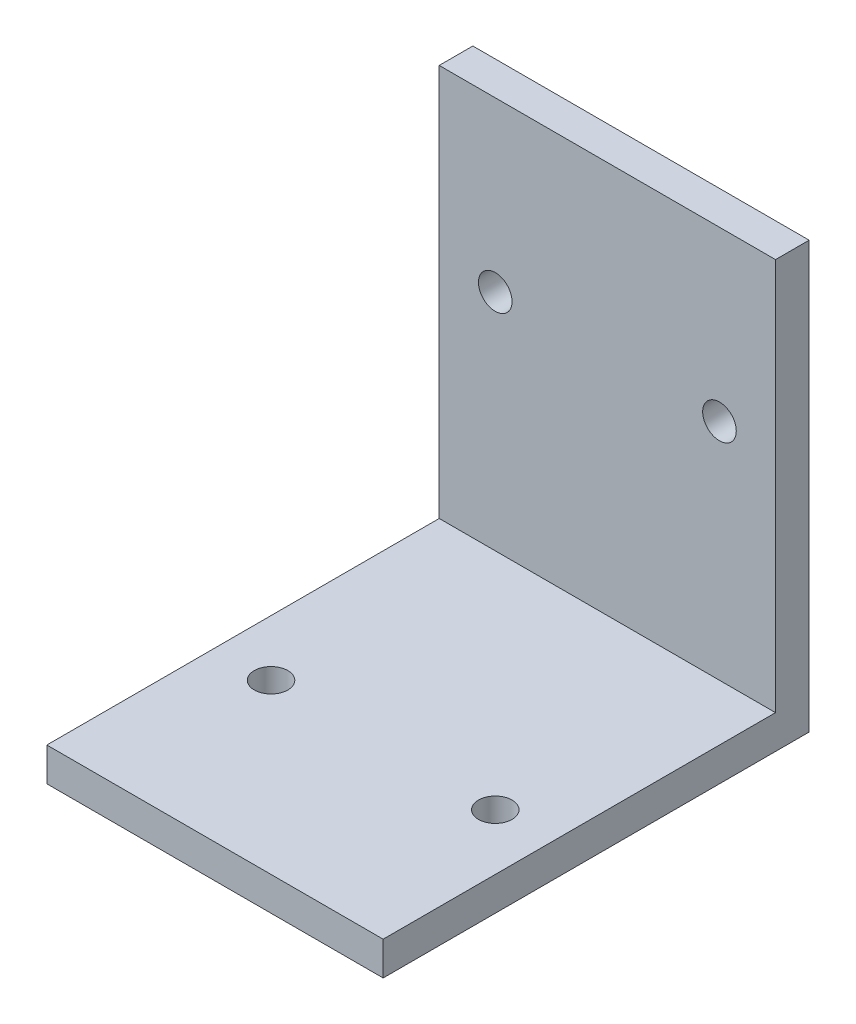
ISO-10303-21;
HEADER;
FILE_DESCRIPTION(('STEP AP214'),'2;1');
FILE_NAME('part.step','',(''),(''),'','','');
FILE_SCHEMA(('AUTOMOTIVE_DESIGN { 1 0 10303 214 1 1 1 1 }'));
ENDSEC;
DATA;
#1=APPLICATION_CONTEXT('core data for automotive mechanical design processes');
#2=APPLICATION_PROTOCOL_DEFINITION('international standard','automotive_design',2000,#1);
#3=PRODUCT_CONTEXT('',#1,'mechanical');
#4=PRODUCT('Part','Part','',(#3));
#5=PRODUCT_RELATED_PRODUCT_CATEGORY('part','',(#4));
#6=PRODUCT_DEFINITION_FORMATION('','',#4);
#7=PRODUCT_DEFINITION_CONTEXT('part definition',#1,'design');
#8=PRODUCT_DEFINITION('design','',#6,#7);
#9=PRODUCT_DEFINITION_SHAPE('','',#8);
#10=(LENGTH_UNIT() NAMED_UNIT(*) SI_UNIT(.MILLI.,.METRE.));
#11=(NAMED_UNIT(*) PLANE_ANGLE_UNIT() SI_UNIT($,.RADIAN.));
#12=(NAMED_UNIT(*) SI_UNIT($,.STERADIAN.) SOLID_ANGLE_UNIT());
#13=UNCERTAINTY_MEASURE_WITH_UNIT(LENGTH_MEASURE(1.E-05),#10,'distance_accuracy_value','');
#14=(GEOMETRIC_REPRESENTATION_CONTEXT(3) GLOBAL_UNCERTAINTY_ASSIGNED_CONTEXT((#13)) GLOBAL_UNIT_ASSIGNED_CONTEXT((#10,
#11,#12)) REPRESENTATION_CONTEXT('',''));
#15=CARTESIAN_POINT('',(0.,0.,0.));
#16=DIRECTION('',(0.,0.,1.));
#17=DIRECTION('',(1.,0.,0.));
#18=AXIS2_PLACEMENT_3D('',#15,#16,#17);
#19=CARTESIAN_POINT('',(15.,19.,3.));
#20=DIRECTION('',(-1.,0.,0.));
#21=DIRECTION('',(0.,0.,1.));
#22=AXIS2_PLACEMENT_3D('',#19,#20,#21);
#23=PLANE('',#22);
#24=DIRECTION('',(0.,1.,0.));
#25=VECTOR('',#24,1.);
#26=CARTESIAN_POINT('',(15.,19.,0.));
#27=LINE('',#26,#25);
#28=CARTESIAN_POINT('',(15.,-19.,0.));
#29=VERTEX_POINT('',#28);
#30=CARTESIAN_POINT('',(15.,19.,0.));
#31=VERTEX_POINT('',#30);
#32=EDGE_CURVE('E96',#29,#31,#27,.T.);
#33=ORIENTED_EDGE('',*,*,#32,.T.);
#34=DIRECTION('',(0.,0.,-1.));
#35=VECTOR('',#34,1.);
#36=CARTESIAN_POINT('',(15.,19.,3.));
#37=LINE('',#36,#35);
#38=CARTESIAN_POINT('',(15.,19.,3.));
#39=VERTEX_POINT('',#38);
#40=EDGE_CURVE('E11',#39,#31,#37,.T.);
#41=ORIENTED_EDGE('',*,*,#40,.F.);
#42=DIRECTION('',(0.,1.,0.));
#43=VECTOR('',#42,1.);
#44=CARTESIAN_POINT('',(15.,19.,3.));
#45=LINE('',#44,#43);
#46=CARTESIAN_POINT('',(15.,-16.,3.));
#47=VERTEX_POINT('',#46);
#48=EDGE_CURVE('E89',#47,#39,#45,.T.);
#49=ORIENTED_EDGE('',*,*,#48,.F.);
#50=DIRECTION('',(0.,0.,-1.));
#51=VECTOR('',#50,1.);
#52=CARTESIAN_POINT('',(15.,-16.,38.));
#53=LINE('',#52,#51);
#54=CARTESIAN_POINT('',(15.,-16.,38.));
#55=VERTEX_POINT('',#54);
#56=EDGE_CURVE('E104',#55,#47,#53,.T.);
#57=ORIENTED_EDGE('',*,*,#56,.F.);
#58=DIRECTION('',(0.,1.,0.));
#59=VECTOR('',#58,1.);
#60=CARTESIAN_POINT('',(15.,-19.,38.));
#61=LINE('',#60,#59);
#62=CARTESIAN_POINT('',(15.,-19.,38.));
#63=VERTEX_POINT('',#62);
#64=EDGE_CURVE('E99',#63,#55,#61,.T.);
#65=ORIENTED_EDGE('',*,*,#64,.F.);
#66=DIRECTION('',(0.,0.,-1.));
#67=VECTOR('',#66,1.);
#68=CARTESIAN_POINT('',(15.,-19.,3.));
#69=LINE('',#68,#67);
#70=EDGE_CURVE('E82',#63,#29,#69,.T.);
#71=ORIENTED_EDGE('',*,*,#70,.T.);
#72=EDGE_LOOP('',(#33,#41,#49,#57,#65,#71));
#73=FACE_BOUND('',#72,.T.);
#74=ADVANCED_FACE('F35',(#73),#23,.F.);
#75=CARTESIAN_POINT('',(-15.,19.,3.));
#76=DIRECTION('',(0.,-1.,0.));
#77=DIRECTION('',(0.,0.,-1.));
#78=AXIS2_PLACEMENT_3D('',#75,#76,#77);
#79=PLANE('',#78);
#80=DIRECTION('',(-1.,0.,0.));
#81=VECTOR('',#80,1.);
#82=CARTESIAN_POINT('',(-15.,19.,0.));
#83=LINE('',#82,#81);
#84=CARTESIAN_POINT('',(-15.,19.,0.));
#85=VERTEX_POINT('',#84);
#86=EDGE_CURVE('E103',#31,#85,#83,.T.);
#87=ORIENTED_EDGE('',*,*,#86,.T.);
#88=DIRECTION('',(0.,0.,-1.));
#89=VECTOR('',#88,1.);
#90=CARTESIAN_POINT('',(-15.,19.,3.));
#91=LINE('',#90,#89);
#92=CARTESIAN_POINT('',(-15.,19.,3.));
#93=VERTEX_POINT('',#92);
#94=EDGE_CURVE('E43',#93,#85,#91,.T.);
#95=ORIENTED_EDGE('',*,*,#94,.F.);
#96=DIRECTION('',(-1.,0.,0.));
#97=VECTOR('',#96,1.);
#98=CARTESIAN_POINT('',(-15.,19.,3.));
#99=LINE('',#98,#97);
#100=EDGE_CURVE('E57',#39,#93,#99,.T.);
#101=ORIENTED_EDGE('',*,*,#100,.F.);
#102=ORIENTED_EDGE('',*,*,#40,.T.);
#103=EDGE_LOOP('',(#87,#95,#101,#102));
#104=FACE_BOUND('',#103,.T.);
#105=ADVANCED_FACE('F161',(#104),#79,.F.);
#106=CARTESIAN_POINT('',(-15.,19.,3.));
#107=DIRECTION('',(1.,0.,0.));
#108=DIRECTION('',(0.,0.,-1.));
#109=AXIS2_PLACEMENT_3D('',#106,#107,#108);
#110=PLANE('',#109);
#111=DIRECTION('',(0.,-1.,0.));
#112=VECTOR('',#111,1.);
#113=CARTESIAN_POINT('',(-15.,19.,0.));
#114=LINE('',#113,#112);
#115=CARTESIAN_POINT('',(-15.,-19.,0.));
#116=VERTEX_POINT('',#115);
#117=EDGE_CURVE('E90',#85,#116,#114,.T.);
#118=ORIENTED_EDGE('',*,*,#117,.T.);
#119=DIRECTION('',(0.,0.,-1.));
#120=VECTOR('',#119,1.);
#121=CARTESIAN_POINT('',(-15.,-19.,3.));
#122=LINE('',#121,#120);
#123=CARTESIAN_POINT('',(-15.,-19.,38.));
#124=VERTEX_POINT('',#123);
#125=EDGE_CURVE('E85',#124,#116,#122,.T.);
#126=ORIENTED_EDGE('',*,*,#125,.F.);
#127=DIRECTION('',(0.,-1.,0.));
#128=VECTOR('',#127,1.);
#129=CARTESIAN_POINT('',(-15.,-19.,38.));
#130=LINE('',#129,#128);
#131=CARTESIAN_POINT('',(-15.,-16.,38.));
#132=VERTEX_POINT('',#131);
#133=EDGE_CURVE('E121',#132,#124,#130,.T.);
#134=ORIENTED_EDGE('',*,*,#133,.F.);
#135=DIRECTION('',(0.,0.,-1.));
#136=VECTOR('',#135,1.);
#137=CARTESIAN_POINT('',(-15.,-16.,38.));
#138=LINE('',#137,#136);
#139=CARTESIAN_POINT('',(-15.,-16.,3.));
#140=VERTEX_POINT('',#139);
#141=EDGE_CURVE('E108',#132,#140,#138,.T.);
#142=ORIENTED_EDGE('',*,*,#141,.T.);
#143=DIRECTION('',(0.,-1.,0.));
#144=VECTOR('',#143,1.);
#145=CARTESIAN_POINT('',(-15.,19.,3.));
#146=LINE('',#145,#144);
#147=EDGE_CURVE('E100',#93,#140,#146,.T.);
#148=ORIENTED_EDGE('',*,*,#147,.F.);
#149=ORIENTED_EDGE('',*,*,#94,.T.);
#150=EDGE_LOOP('',(#118,#126,#134,#142,#148,#149));
#151=FACE_BOUND('',#150,.T.);
#152=ADVANCED_FACE('F152',(#151),#110,.F.);
#153=CARTESIAN_POINT('',(-15.,-19.,3.));
#154=DIRECTION('',(0.,1.,0.));
#155=DIRECTION('',(0.,0.,1.));
#156=AXIS2_PLACEMENT_3D('',#153,#154,#155);
#157=PLANE('',#156);
#158=CARTESIAN_POINT('',(9.99999999999999,-19.,23.));
#159=DIRECTION('',(0.,1.,0.));
#160=DIRECTION('',(0.,0.,1.));
#161=AXIS2_PLACEMENT_3D('',#158,#159,#160);
#162=CIRCLE('',#161,1.5);
#163=CARTESIAN_POINT('',(9.99999999999999,-19.,24.5));
#164=VERTEX_POINT('',#163);
#165=EDGE_CURVE('E205',#164,#164,#162,.T.);
#166=ORIENTED_EDGE('',*,*,#165,.T.);
#167=EDGE_LOOP('',(#166));
#168=FACE_BOUND('',#167,.T.);
#169=CARTESIAN_POINT('',(-10.,-19.,23.));
#170=DIRECTION('',(0.,1.,0.));
#171=DIRECTION('',(0.,0.,1.));
#172=AXIS2_PLACEMENT_3D('',#169,#170,#171);
#173=CIRCLE('',#172,1.5);
#174=CARTESIAN_POINT('',(-10.,-19.,24.5));
#175=VERTEX_POINT('',#174);
#176=EDGE_CURVE('E209',#175,#175,#173,.T.);
#177=ORIENTED_EDGE('',*,*,#176,.T.);
#178=EDGE_LOOP('',(#177));
#179=FACE_BOUND('',#178,.T.);
#180=DIRECTION('',(1.,0.,0.));
#181=VECTOR('',#180,1.);
#182=CARTESIAN_POINT('',(-15.,-19.,0.));
#183=LINE('',#182,#181);
#184=EDGE_CURVE('E77',#116,#29,#183,.T.);
#185=ORIENTED_EDGE('',*,*,#184,.T.);
#186=ORIENTED_EDGE('',*,*,#70,.F.);
#187=DIRECTION('',(1.,0.,0.));
#188=VECTOR('',#187,1.);
#189=CARTESIAN_POINT('',(-15.,-19.,38.));
#190=LINE('',#189,#188);
#191=EDGE_CURVE('E134',#124,#63,#190,.T.);
#192=ORIENTED_EDGE('',*,*,#191,.F.);
#193=ORIENTED_EDGE('',*,*,#125,.T.);
#194=EDGE_LOOP('',(#185,#186,#192,#193));
#195=FACE_BOUND('',#194,.T.);
#196=ADVANCED_FACE('F79',(#168,#179,#195),#157,.F.);
#197=CARTESIAN_POINT('',(0.,0.,3.));
#198=DIRECTION('',(0.,0.,1.));
#199=DIRECTION('',(1.,0.,0.));
#200=AXIS2_PLACEMENT_3D('',#197,#198,#199);
#201=PLANE('',#200);
#202=CARTESIAN_POINT('',(9.99999999999999,4.,3.));
#203=DIRECTION('',(0.,0.,1.));
#204=DIRECTION('',(1.,0.,0.));
#205=AXIS2_PLACEMENT_3D('',#202,#203,#204);
#206=CIRCLE('',#205,1.5);
#207=CARTESIAN_POINT('',(11.5,4.,3.));
#208=VERTEX_POINT('',#207);
#209=EDGE_CURVE('E128',#208,#208,#206,.T.);
#210=ORIENTED_EDGE('',*,*,#209,.F.);
#211=EDGE_LOOP('',(#210));
#212=FACE_BOUND('',#211,.T.);
#213=CARTESIAN_POINT('',(-10.,4.,3.));
#214=DIRECTION('',(0.,0.,1.));
#215=DIRECTION('',(1.,0.,0.));
#216=AXIS2_PLACEMENT_3D('',#213,#214,#215);
#217=CIRCLE('',#216,1.5);
#218=CARTESIAN_POINT('',(-8.5,4.,3.));
#219=VERTEX_POINT('',#218);
#220=EDGE_CURVE('E118',#219,#219,#217,.T.);
#221=ORIENTED_EDGE('',*,*,#220,.F.);
#222=EDGE_LOOP('',(#221));
#223=FACE_BOUND('',#222,.T.);
#224=DIRECTION('',(-1.,0.,0.));
#225=VECTOR('',#224,1.);
#226=CARTESIAN_POINT('',(-15.,-16.,3.));
#227=LINE('',#226,#225);
#228=EDGE_CURVE('E51',#47,#140,#227,.T.);
#229=ORIENTED_EDGE('',*,*,#228,.F.);
#230=ORIENTED_EDGE('',*,*,#48,.T.);
#231=ORIENTED_EDGE('',*,*,#100,.T.);
#232=ORIENTED_EDGE('',*,*,#147,.T.);
#233=EDGE_LOOP('',(#229,#230,#231,#232));
#234=FACE_BOUND('',#233,.T.);
#235=ADVANCED_FACE('F144',(#212,#223,#234),#201,.T.);
#236=CARTESIAN_POINT('',(0.,0.,0.));
#237=DIRECTION('',(0.,0.,1.));
#238=DIRECTION('',(1.,0.,0.));
#239=AXIS2_PLACEMENT_3D('',#236,#237,#238);
#240=PLANE('',#239);
#241=CARTESIAN_POINT('',(9.99999999999999,4.,0.));
#242=DIRECTION('',(0.,0.,1.));
#243=DIRECTION('',(1.,0.,0.));
#244=AXIS2_PLACEMENT_3D('',#241,#242,#243);
#245=CIRCLE('',#244,1.5);
#246=CARTESIAN_POINT('',(11.5,4.,0.));
#247=VERTEX_POINT('',#246);
#248=EDGE_CURVE('E38',#247,#247,#245,.T.);
#249=ORIENTED_EDGE('',*,*,#248,.T.);
#250=EDGE_LOOP('',(#249));
#251=FACE_BOUND('',#250,.T.);
#252=CARTESIAN_POINT('',(-10.,4.,0.));
#253=DIRECTION('',(0.,0.,1.));
#254=DIRECTION('',(1.,0.,0.));
#255=AXIS2_PLACEMENT_3D('',#252,#253,#254);
#256=CIRCLE('',#255,1.5);
#257=CARTESIAN_POINT('',(-8.5,4.,0.));
#258=VERTEX_POINT('',#257);
#259=EDGE_CURVE('E116',#258,#258,#256,.T.);
#260=ORIENTED_EDGE('',*,*,#259,.T.);
#261=EDGE_LOOP('',(#260));
#262=FACE_BOUND('',#261,.T.);
#263=ORIENTED_EDGE('',*,*,#32,.F.);
#264=ORIENTED_EDGE('',*,*,#184,.F.);
#265=ORIENTED_EDGE('',*,*,#117,.F.);
#266=ORIENTED_EDGE('',*,*,#86,.F.);
#267=EDGE_LOOP('',(#263,#264,#265,#266));
#268=FACE_BOUND('',#267,.T.);
#269=ADVANCED_FACE('F102',(#251,#262,#268),#240,.F.);
#270=CARTESIAN_POINT('',(-15.,-16.,38.));
#271=DIRECTION('',(0.,-1.,0.));
#272=DIRECTION('',(0.,0.,-1.));
#273=AXIS2_PLACEMENT_3D('',#270,#271,#272);
#274=PLANE('',#273);
#275=CARTESIAN_POINT('',(9.99999999999999,-16.,23.));
#276=DIRECTION('',(0.,1.,0.));
#277=DIRECTION('',(0.,0.,1.));
#278=AXIS2_PLACEMENT_3D('',#275,#276,#277);
#279=CIRCLE('',#278,1.5);
#280=CARTESIAN_POINT('',(9.99999999999999,-16.,24.5));
#281=VERTEX_POINT('',#280);
#282=EDGE_CURVE('E202',#281,#281,#279,.T.);
#283=ORIENTED_EDGE('',*,*,#282,.F.);
#284=EDGE_LOOP('',(#283));
#285=FACE_BOUND('',#284,.T.);
#286=CARTESIAN_POINT('',(-10.,-16.,23.));
#287=DIRECTION('',(0.,1.,0.));
#288=DIRECTION('',(0.,0.,1.));
#289=AXIS2_PLACEMENT_3D('',#286,#287,#288);
#290=CIRCLE('',#289,1.5);
#291=CARTESIAN_POINT('',(-10.,-16.,24.5));
#292=VERTEX_POINT('',#291);
#293=EDGE_CURVE('E206',#292,#292,#290,.T.);
#294=ORIENTED_EDGE('',*,*,#293,.F.);
#295=EDGE_LOOP('',(#294));
#296=FACE_BOUND('',#295,.T.);
#297=ORIENTED_EDGE('',*,*,#228,.T.);
#298=ORIENTED_EDGE('',*,*,#141,.F.);
#299=DIRECTION('',(-1.,0.,0.));
#300=VECTOR('',#299,1.);
#301=CARTESIAN_POINT('',(-15.,-16.,38.));
#302=LINE('',#301,#300);
#303=EDGE_CURVE('E137',#55,#132,#302,.T.);
#304=ORIENTED_EDGE('',*,*,#303,.F.);
#305=ORIENTED_EDGE('',*,*,#56,.T.);
#306=EDGE_LOOP('',(#297,#298,#304,#305));
#307=FACE_BOUND('',#306,.T.);
#308=ADVANCED_FACE('F149',(#285,#296,#307),#274,.F.);
#309=CARTESIAN_POINT('',(0.,0.,38.));
#310=DIRECTION('',(0.,0.,-1.));
#311=DIRECTION('',(-1.,0.,0.));
#312=AXIS2_PLACEMENT_3D('',#309,#310,#311);
#313=PLANE('',#312);
#314=ORIENTED_EDGE('',*,*,#133,.T.);
#315=ORIENTED_EDGE('',*,*,#191,.T.);
#316=ORIENTED_EDGE('',*,*,#64,.T.);
#317=ORIENTED_EDGE('',*,*,#303,.T.);
#318=EDGE_LOOP('',(#314,#315,#316,#317));
#319=FACE_BOUND('',#318,.T.);
#320=ADVANCED_FACE('F156',(#319),#313,.F.);
#321=CARTESIAN_POINT('',(-10.,4.,-32.));
#322=DIRECTION('',(0.,0.,1.));
#323=DIRECTION('',(1.,0.,0.));
#324=AXIS2_PLACEMENT_3D('',#321,#322,#323);
#325=CYLINDRICAL_SURFACE('',#324,1.5);
#326=ORIENTED_EDGE('',*,*,#220,.T.);
#327=EDGE_LOOP('',(#326));
#328=FACE_BOUND('',#327,.T.);
#329=ORIENTED_EDGE('',*,*,#259,.F.);
#330=EDGE_LOOP('',(#329));
#331=FACE_BOUND('',#330,.T.);
#332=ADVANCED_FACE('F183',(#328,#331),#325,.F.);
#333=CARTESIAN_POINT('',(9.99999999999999,4.,-32.));
#334=DIRECTION('',(0.,0.,1.));
#335=DIRECTION('',(1.,0.,0.));
#336=AXIS2_PLACEMENT_3D('',#333,#334,#335);
#337=CYLINDRICAL_SURFACE('',#336,1.5);
#338=ORIENTED_EDGE('',*,*,#209,.T.);
#339=EDGE_LOOP('',(#338));
#340=FACE_BOUND('',#339,.T.);
#341=ORIENTED_EDGE('',*,*,#248,.F.);
#342=EDGE_LOOP('',(#341));
#343=FACE_BOUND('',#342,.T.);
#344=ADVANCED_FACE('F186',(#340,#343),#337,.F.);
#345=CARTESIAN_POINT('',(-10.,-51.,23.));
#346=DIRECTION('',(0.,1.,0.));
#347=DIRECTION('',(0.,0.,1.));
#348=AXIS2_PLACEMENT_3D('',#345,#346,#347);
#349=CYLINDRICAL_SURFACE('',#348,1.5);
#350=ORIENTED_EDGE('',*,*,#293,.T.);
#351=EDGE_LOOP('',(#350));
#352=FACE_BOUND('',#351,.T.);
#353=ORIENTED_EDGE('',*,*,#176,.F.);
#354=EDGE_LOOP('',(#353));
#355=FACE_BOUND('',#354,.T.);
#356=ADVANCED_FACE('F189',(#352,#355),#349,.F.);
#357=CARTESIAN_POINT('',(9.99999999999999,-51.,23.));
#358=DIRECTION('',(0.,1.,0.));
#359=DIRECTION('',(0.,0.,1.));
#360=AXIS2_PLACEMENT_3D('',#357,#358,#359);
#361=CYLINDRICAL_SURFACE('',#360,1.5);
#362=ORIENTED_EDGE('',*,*,#282,.T.);
#363=EDGE_LOOP('',(#362));
#364=FACE_BOUND('',#363,.T.);
#365=ORIENTED_EDGE('',*,*,#165,.F.);
#366=EDGE_LOOP('',(#365));
#367=FACE_BOUND('',#366,.T.);
#368=ADVANCED_FACE('F193',(#364,#367),#361,.F.);
#369=CLOSED_SHELL('',(#74,#105,#152,#196,#235,#269,#308,#320,#332,#344,#356,#368));
#370=MANIFOLD_SOLID_BREP('B2',#369);
#371=ADVANCED_BREP_SHAPE_REPRESENTATION('',(#18,#370),#14);
#372=SHAPE_DEFINITION_REPRESENTATION(#9,#371);
ENDSEC;
END-ISO-10303-21;
